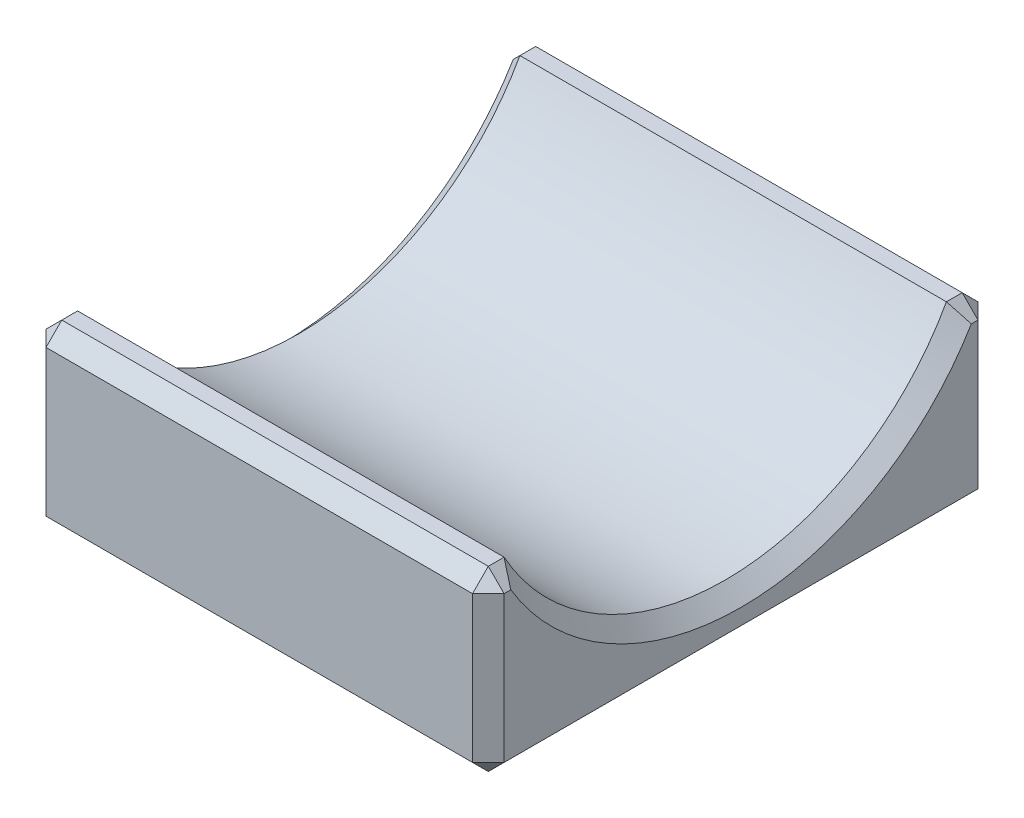
ISO-10303-21;
HEADER;
FILE_DESCRIPTION(('STEP AP214'),'2;1');
FILE_NAME('part.step','',(''),(''),'','','');
FILE_SCHEMA(('AUTOMOTIVE_DESIGN { 1 0 10303 214 1 1 1 1 }'));
ENDSEC;
DATA;
#1=APPLICATION_CONTEXT('core data for automotive mechanical design processes');
#2=APPLICATION_PROTOCOL_DEFINITION('international standard','automotive_design',2000,#1);
#3=PRODUCT_CONTEXT('',#1,'mechanical');
#4=PRODUCT('Part','Part','',(#3));
#5=PRODUCT_RELATED_PRODUCT_CATEGORY('part','',(#4));
#6=PRODUCT_DEFINITION_FORMATION('','',#4);
#7=PRODUCT_DEFINITION_CONTEXT('part definition',#1,'design');
#8=PRODUCT_DEFINITION('design','',#6,#7);
#9=PRODUCT_DEFINITION_SHAPE('','',#8);
#10=(LENGTH_UNIT() NAMED_UNIT(*) SI_UNIT(.MILLI.,.METRE.));
#11=(NAMED_UNIT(*) PLANE_ANGLE_UNIT() SI_UNIT($,.RADIAN.));
#12=(NAMED_UNIT(*) SI_UNIT($,.STERADIAN.) SOLID_ANGLE_UNIT());
#13=UNCERTAINTY_MEASURE_WITH_UNIT(LENGTH_MEASURE(1.E-05),#10,'distance_accuracy_value','');
#14=(GEOMETRIC_REPRESENTATION_CONTEXT(3) GLOBAL_UNCERTAINTY_ASSIGNED_CONTEXT((#13)) GLOBAL_UNIT_ASSIGNED_CONTEXT((#10,
#11,#12)) REPRESENTATION_CONTEXT('',''));
#15=CARTESIAN_POINT('',(0.,0.,0.));
#16=DIRECTION('',(0.,0.,1.));
#17=DIRECTION('',(1.,0.,0.));
#18=AXIS2_PLACEMENT_3D('',#15,#16,#17);
#19=CARTESIAN_POINT('',(-42.,17.5,83.6290559242941));
#20=DIRECTION('',(-1.,0.,0.));
#21=DIRECTION('',(0.,0.,1.));
#22=AXIS2_PLACEMENT_3D('',#19,#20,#21);
#23=PLANE('',#22);
#24=DIRECTION('',(0.,1.,0.));
#25=VECTOR('',#24,1.);
#26=CARTESIAN_POINT('',(-42.,13.6270166537926,91.1290559242941));
#27=LINE('',#26,#25);
#28=CARTESIAN_POINT('',(-42.,8.5,91.1290559242941));
#29=VERTEX_POINT('',#28);
#30=CARTESIAN_POINT('',(-42.,13.1270166537926,91.1290559242941));
#31=VERTEX_POINT('',#30);
#32=EDGE_CURVE('E250',#29,#31,#27,.T.);
#33=ORIENTED_EDGE('',*,*,#32,.T.);
#34=DIRECTION('',(0.,0.,-1.));
#35=VECTOR('',#34,1.);
#36=CARTESIAN_POINT('',(-42.,13.1270166537926,90.6290559242941));
#37=LINE('',#36,#35);
#38=CARTESIAN_POINT('',(-42.,13.1270166537926,90.9178841328467));
#39=VERTEX_POINT('',#38);
#40=EDGE_CURVE('E11',#31,#39,#37,.T.);
#41=ORIENTED_EDGE('',*,*,#40,.T.);
#42=CARTESIAN_POINT('',(-42.,17.5,83.6290559242941));
#43=DIRECTION('',(-1.,0.,0.));
#44=DIRECTION('',(0.,0.,1.));
#45=AXIS2_PLACEMENT_3D('',#42,#43,#44);
#46=CIRCLE('',#45,8.5);
#47=CARTESIAN_POINT('',(-42.,13.1270166537926,76.3402277157414));
#48=VERTEX_POINT('',#47);
#49=EDGE_CURVE('E58',#39,#48,#46,.F.);
#50=ORIENTED_EDGE('',*,*,#49,.T.);
#51=DIRECTION('',(0.,0.,-1.));
#52=VECTOR('',#51,1.);
#53=CARTESIAN_POINT('',(-42.,13.1270166537926,75.6290559242941));
#54=LINE('',#53,#52);
#55=CARTESIAN_POINT('',(-42.,13.1270166537926,76.1290559242941));
#56=VERTEX_POINT('',#55);
#57=EDGE_CURVE('E256',#48,#56,#54,.T.);
#58=ORIENTED_EDGE('',*,*,#57,.T.);
#59=DIRECTION('',(0.,-1.,0.));
#60=VECTOR('',#59,1.);
#61=CARTESIAN_POINT('',(-42.,8.,76.1290559242941));
#62=LINE('',#61,#60);
#63=CARTESIAN_POINT('',(-42.,8.5,76.1290559242941));
#64=VERTEX_POINT('',#63);
#65=EDGE_CURVE('E254',#56,#64,#62,.T.);
#66=ORIENTED_EDGE('',*,*,#65,.T.);
#67=DIRECTION('',(0.,0.,1.));
#68=VECTOR('',#67,1.);
#69=CARTESIAN_POINT('',(-42.,8.5,91.6290559242941));
#70=LINE('',#69,#68);
#71=EDGE_CURVE('E252',#64,#29,#70,.T.);
#72=ORIENTED_EDGE('',*,*,#71,.T.);
#73=EDGE_LOOP('',(#33,#41,#50,#58,#66,#72));
#74=FACE_BOUND('',#73,.T.);
#75=ADVANCED_FACE('F43',(#74),#23,.T.);
#76=CARTESIAN_POINT('',(-10.5393597873766,13.6270166537926,76.6290559242941));
#77=DIRECTION('',(0.,-1.,0.));
#78=DIRECTION('',(0.,0.,-1.));
#79=AXIS2_PLACEMENT_3D('',#76,#77,#78);
#80=PLANE('',#79);
#81=DIRECTION('',(-1.,0.,0.));
#82=VECTOR('',#81,1.);
#83=CARTESIAN_POINT('',(-10.5393597873766,13.6270166537926,76.6290559242941));
#84=LINE('',#83,#82);
#85=CARTESIAN_POINT('',(-28.,13.6270166537926,76.6290559242941));
#86=VERTEX_POINT('',#85);
#87=CARTESIAN_POINT('',(-41.5,13.6270166537926,76.6290559242941));
#88=VERTEX_POINT('',#87);
#89=EDGE_CURVE('E530',#86,#88,#84,.T.);
#90=ORIENTED_EDGE('',*,*,#89,.F.);
#91=DIRECTION('',(0.,0.,-1.));
#92=VECTOR('',#91,1.);
#93=CARTESIAN_POINT('',(-28.,13.6270166537926,76.6290559242941));
#94=LINE('',#93,#92);
#95=CARTESIAN_POINT('',(-28.,13.6270166537926,76.1290559242941));
#96=VERTEX_POINT('',#95);
#97=EDGE_CURVE('E225',#86,#96,#94,.T.);
#98=ORIENTED_EDGE('',*,*,#97,.T.);
#99=DIRECTION('',(-1.,0.,0.));
#100=VECTOR('',#99,1.);
#101=CARTESIAN_POINT('',(-10.5393597873766,13.6270166537926,76.1290559242941));
#102=LINE('',#101,#100);
#103=CARTESIAN_POINT('',(-41.5,13.6270166537926,76.1290559242941));
#104=VERTEX_POINT('',#103);
#105=EDGE_CURVE('E222',#96,#104,#102,.T.);
#106=ORIENTED_EDGE('',*,*,#105,.T.);
#107=DIRECTION('',(0.,0.,1.));
#108=VECTOR('',#107,1.);
#109=CARTESIAN_POINT('',(-41.5,13.6270166537926,76.6290559242941));
#110=LINE('',#109,#108);
#111=EDGE_CURVE('E220',#104,#88,#110,.T.);
#112=ORIENTED_EDGE('',*,*,#111,.T.);
#113=EDGE_LOOP('',(#90,#98,#106,#112));
#114=FACE_BOUND('',#113,.T.);
#115=ADVANCED_FACE('F410',(#114),#80,.F.);
#116=CARTESIAN_POINT('',(-10.5393597873766,13.6270166537926,75.6290559242941));
#117=DIRECTION('',(0.,0.,1.));
#118=DIRECTION('',(1.,0.,0.));
#119=AXIS2_PLACEMENT_3D('',#116,#117,#118);
#120=PLANE('',#119);
#121=DIRECTION('',(1.,0.,0.));
#122=VECTOR('',#121,1.);
#123=CARTESIAN_POINT('',(-10.5393597873766,13.1270166537926,75.6290559242941));
#124=LINE('',#123,#122);
#125=CARTESIAN_POINT('',(-41.5,13.1270166537926,75.6290559242941));
#126=VERTEX_POINT('',#125);
#127=CARTESIAN_POINT('',(-28.,13.1270166537926,75.6290559242941));
#128=VERTEX_POINT('',#127);
#129=EDGE_CURVE('E213',#126,#128,#124,.T.);
#130=ORIENTED_EDGE('',*,*,#129,.T.);
#131=DIRECTION('',(0.,-1.,0.));
#132=VECTOR('',#131,1.);
#133=CARTESIAN_POINT('',(-28.,13.6270166537926,75.6290559242941));
#134=LINE('',#133,#132);
#135=CARTESIAN_POINT('',(-28.,8.49999999999999,75.6290559242941));
#136=VERTEX_POINT('',#135);
#137=EDGE_CURVE('E218',#128,#136,#134,.T.);
#138=ORIENTED_EDGE('',*,*,#137,.T.);
#139=DIRECTION('',(-1.,0.,0.));
#140=VECTOR('',#139,1.);
#141=CARTESIAN_POINT('',(-10.5393597873766,8.49999999999999,75.6290559242941));
#142=LINE('',#141,#140);
#143=CARTESIAN_POINT('',(-41.5,8.49999999999999,75.6290559242941));
#144=VERTEX_POINT('',#143);
#145=EDGE_CURVE('E215',#136,#144,#142,.T.);
#146=ORIENTED_EDGE('',*,*,#145,.T.);
#147=DIRECTION('',(0.,1.,0.));
#148=VECTOR('',#147,1.);
#149=CARTESIAN_POINT('',(-41.5,13.6270166537926,75.6290559242941));
#150=LINE('',#149,#148);
#151=EDGE_CURVE('E211',#144,#126,#150,.T.);
#152=ORIENTED_EDGE('',*,*,#151,.T.);
#153=EDGE_LOOP('',(#130,#138,#146,#152));
#154=FACE_BOUND('',#153,.T.);
#155=ADVANCED_FACE('F416',(#154),#120,.F.);
#156=CARTESIAN_POINT('',(-10.5393597873766,8.,75.6290559242941));
#157=DIRECTION('',(0.,1.,0.));
#158=DIRECTION('',(0.,0.,1.));
#159=AXIS2_PLACEMENT_3D('',#156,#157,#158);
#160=PLANE('',#159);
#161=DIRECTION('',(1.,0.,0.));
#162=VECTOR('',#161,1.);
#163=CARTESIAN_POINT('',(-10.5393597873766,8.,76.1290559242941));
#164=LINE('',#163,#162);
#165=CARTESIAN_POINT('',(-41.5,8.,76.1290559242941));
#166=VERTEX_POINT('',#165);
#167=CARTESIAN_POINT('',(-28.,8.,76.1290559242941));
#168=VERTEX_POINT('',#167);
#169=EDGE_CURVE('E193',#166,#168,#164,.T.);
#170=ORIENTED_EDGE('',*,*,#169,.T.);
#171=DIRECTION('',(0.,0.,1.));
#172=VECTOR('',#171,1.);
#173=CARTESIAN_POINT('',(-28.,8.,75.6290559242941));
#174=LINE('',#173,#172);
#175=CARTESIAN_POINT('',(-28.,8.,91.1290559242941));
#176=VERTEX_POINT('',#175);
#177=EDGE_CURVE('E198',#168,#176,#174,.T.);
#178=ORIENTED_EDGE('',*,*,#177,.T.);
#179=DIRECTION('',(-1.,0.,0.));
#180=VECTOR('',#179,1.);
#181=CARTESIAN_POINT('',(-10.5393597873766,8.,91.1290559242941));
#182=LINE('',#181,#180);
#183=CARTESIAN_POINT('',(-41.5,8.,91.1290559242941));
#184=VERTEX_POINT('',#183);
#185=EDGE_CURVE('E169',#176,#184,#182,.T.);
#186=ORIENTED_EDGE('',*,*,#185,.T.);
#187=DIRECTION('',(0.,0.,-1.));
#188=VECTOR('',#187,1.);
#189=CARTESIAN_POINT('',(-41.5,8.,75.6290559242941));
#190=LINE('',#189,#188);
#191=EDGE_CURVE('E187',#184,#166,#190,.T.);
#192=ORIENTED_EDGE('',*,*,#191,.T.);
#193=EDGE_LOOP('',(#170,#178,#186,#192));
#194=FACE_BOUND('',#193,.T.);
#195=ADVANCED_FACE('F196',(#194),#160,.F.);
#196=CARTESIAN_POINT('',(-10.5393597873766,8.,91.6290559242941));
#197=DIRECTION('',(0.,0.,-1.));
#198=DIRECTION('',(-1.,0.,0.));
#199=AXIS2_PLACEMENT_3D('',#196,#197,#198);
#200=PLANE('',#199);
#201=DIRECTION('',(0.,-1.,0.));
#202=VECTOR('',#201,1.);
#203=CARTESIAN_POINT('',(-41.5,8.,91.6290559242941));
#204=LINE('',#203,#202);
#205=CARTESIAN_POINT('',(-41.5,13.1270166537926,91.6290559242941));
#206=VERTEX_POINT('',#205);
#207=CARTESIAN_POINT('',(-41.5,8.49999999999999,91.6290559242941));
#208=VERTEX_POINT('',#207);
#209=EDGE_CURVE('E206',#206,#208,#204,.T.);
#210=ORIENTED_EDGE('',*,*,#209,.T.);
#211=DIRECTION('',(1.,0.,0.));
#212=VECTOR('',#211,1.);
#213=CARTESIAN_POINT('',(-10.5393597873766,8.49999999999999,91.6290559242941));
#214=LINE('',#213,#212);
#215=CARTESIAN_POINT('',(-28.,8.49999999999999,91.6290559242941));
#216=VERTEX_POINT('',#215);
#217=EDGE_CURVE('E171',#208,#216,#214,.T.);
#218=ORIENTED_EDGE('',*,*,#217,.T.);
#219=DIRECTION('',(0.,1.,0.));
#220=VECTOR('',#219,1.);
#221=CARTESIAN_POINT('',(-28.,8.,91.6290559242941));
#222=LINE('',#221,#220);
#223=CARTESIAN_POINT('',(-28.,13.1270166537926,91.6290559242941));
#224=VERTEX_POINT('',#223);
#225=EDGE_CURVE('E208',#216,#224,#222,.T.);
#226=ORIENTED_EDGE('',*,*,#225,.T.);
#227=DIRECTION('',(-1.,0.,0.));
#228=VECTOR('',#227,1.);
#229=CARTESIAN_POINT('',(-10.5393597873766,13.1270166537926,91.6290559242941));
#230=LINE('',#229,#228);
#231=EDGE_CURVE('E201',#224,#206,#230,.T.);
#232=ORIENTED_EDGE('',*,*,#231,.T.);
#233=EDGE_LOOP('',(#210,#218,#226,#232));
#234=FACE_BOUND('',#233,.T.);
#235=ADVANCED_FACE('F425',(#234),#200,.F.);
#236=CARTESIAN_POINT('',(-10.5393597873766,13.6270166537926,91.6290559242941));
#237=DIRECTION('',(0.,-1.,0.));
#238=DIRECTION('',(0.,0.,-1.));
#239=AXIS2_PLACEMENT_3D('',#236,#237,#238);
#240=PLANE('',#239);
#241=DIRECTION('',(1.,0.,0.));
#242=VECTOR('',#241,1.);
#243=CARTESIAN_POINT('',(-10.5393597873766,13.6270166537926,91.1290559242941));
#244=LINE('',#243,#242);
#245=CARTESIAN_POINT('',(-41.5,13.6270166537926,91.1290559242941));
#246=VERTEX_POINT('',#245);
#247=CARTESIAN_POINT('',(-28.,13.6270166537926,91.1290559242941));
#248=VERTEX_POINT('',#247);
#249=EDGE_CURVE('E244',#246,#248,#244,.T.);
#250=ORIENTED_EDGE('',*,*,#249,.T.);
#251=DIRECTION('',(0.,0.,-1.));
#252=VECTOR('',#251,1.);
#253=CARTESIAN_POINT('',(-28.,13.6270166537926,91.6290559242941));
#254=LINE('',#253,#252);
#255=CARTESIAN_POINT('',(-28.,13.6270166537926,90.6290559242941));
#256=VERTEX_POINT('',#255);
#257=EDGE_CURVE('E248',#248,#256,#254,.T.);
#258=ORIENTED_EDGE('',*,*,#257,.T.);
#259=DIRECTION('',(-1.,0.,0.));
#260=VECTOR('',#259,1.);
#261=CARTESIAN_POINT('',(-10.5393597873766,13.6270166537926,90.6290559242941));
#262=LINE('',#261,#260);
#263=CARTESIAN_POINT('',(-41.5,13.6270166537926,90.6290559242941));
#264=VERTEX_POINT('',#263);
#265=EDGE_CURVE('E194',#256,#264,#262,.T.);
#266=ORIENTED_EDGE('',*,*,#265,.T.);
#267=DIRECTION('',(0.,0.,1.));
#268=VECTOR('',#267,1.);
#269=CARTESIAN_POINT('',(-41.5,13.6270166537926,91.6290559242941));
#270=LINE('',#269,#268);
#271=EDGE_CURVE('E246',#264,#246,#270,.T.);
#272=ORIENTED_EDGE('',*,*,#271,.T.);
#273=EDGE_LOOP('',(#250,#258,#266,#272));
#274=FACE_BOUND('',#273,.T.);
#275=ADVANCED_FACE('F428',(#274),#240,.F.);
#276=CARTESIAN_POINT('',(-10.5393597873766,17.5,83.6290559242941));
#277=DIRECTION('',(-1.,0.,0.));
#278=DIRECTION('',(0.,0.,1.));
#279=AXIS2_PLACEMENT_3D('',#276,#277,#278);
#280=CYLINDRICAL_SURFACE('',#279,7.99999999999999);
#281=ORIENTED_EDGE('',*,*,#265,.F.);
#282=CARTESIAN_POINT('',(-28.,17.5,83.6290559242941));
#283=DIRECTION('',(-1.,0.,0.));
#284=DIRECTION('',(0.,0.,1.));
#285=AXIS2_PLACEMENT_3D('',#282,#283,#284);
#286=CIRCLE('',#285,7.99999999999999);
#287=EDGE_CURVE('E229',#256,#86,#286,.F.);
#288=ORIENTED_EDGE('',*,*,#287,.T.);
#289=ORIENTED_EDGE('',*,*,#89,.T.);
#290=CARTESIAN_POINT('',(-41.5,17.5,83.6290559242941));
#291=DIRECTION('',(-1.,0.,0.));
#292=DIRECTION('',(0.,0.,1.));
#293=AXIS2_PLACEMENT_3D('',#290,#291,#292);
#294=CIRCLE('',#293,7.99999999999999);
#295=EDGE_CURVE('E227',#88,#264,#294,.T.);
#296=ORIENTED_EDGE('',*,*,#295,.T.);
#297=EDGE_LOOP('',(#281,#288,#289,#296));
#298=FACE_BOUND('',#297,.T.);
#299=ADVANCED_FACE('F405',(#298),#280,.F.);
#300=CARTESIAN_POINT('',(-27.5,25.5,83.6290559242941));
#301=DIRECTION('',(-1.,0.,0.));
#302=DIRECTION('',(0.,0.,1.));
#303=AXIS2_PLACEMENT_3D('',#300,#301,#302);
#304=PLANE('',#303);
#305=DIRECTION('',(0.,0.,1.));
#306=VECTOR('',#305,1.);
#307=CARTESIAN_POINT('',(-27.5,13.1270166537926,83.6290559242941));
#308=LINE('',#307,#306);
#309=CARTESIAN_POINT('',(-27.5,13.1270166537926,76.1290559242941));
#310=VERTEX_POINT('',#309);
#311=CARTESIAN_POINT('',(-27.5,13.1270166537926,76.3402277157414));
#312=VERTEX_POINT('',#311);
#313=EDGE_CURVE('E239',#310,#312,#308,.T.);
#314=ORIENTED_EDGE('',*,*,#313,.T.);
#315=CARTESIAN_POINT('',(-27.5,17.5,83.6290559242941));
#316=DIRECTION('',(-1.,0.,0.));
#317=DIRECTION('',(0.,0.,1.));
#318=AXIS2_PLACEMENT_3D('',#315,#316,#317);
#319=CIRCLE('',#318,8.5);
#320=CARTESIAN_POINT('',(-27.5,13.1270166537926,90.9178841328467));
#321=VERTEX_POINT('',#320);
#322=EDGE_CURVE('E241',#312,#321,#319,.T.);
#323=ORIENTED_EDGE('',*,*,#322,.T.);
#324=DIRECTION('',(0.,0.,1.));
#325=VECTOR('',#324,1.);
#326=CARTESIAN_POINT('',(-27.5,13.1270166537926,83.6290559242941));
#327=LINE('',#326,#325);
#328=CARTESIAN_POINT('',(-27.5,13.1270166537926,91.1290559242941));
#329=VERTEX_POINT('',#328);
#330=EDGE_CURVE('E231',#321,#329,#327,.T.);
#331=ORIENTED_EDGE('',*,*,#330,.T.);
#332=DIRECTION('',(0.,-1.,0.));
#333=VECTOR('',#332,1.);
#334=CARTESIAN_POINT('',(-27.5,25.5,91.1290559242941));
#335=LINE('',#334,#333);
#336=CARTESIAN_POINT('',(-27.5,8.5,91.1290559242941));
#337=VERTEX_POINT('',#336);
#338=EDGE_CURVE('E233',#329,#337,#335,.T.);
#339=ORIENTED_EDGE('',*,*,#338,.T.);
#340=DIRECTION('',(0.,0.,-1.));
#341=VECTOR('',#340,1.);
#342=CARTESIAN_POINT('',(-27.5,8.5,83.6290559242941));
#343=LINE('',#342,#341);
#344=CARTESIAN_POINT('',(-27.5,8.5,76.1290559242941));
#345=VERTEX_POINT('',#344);
#346=EDGE_CURVE('E235',#337,#345,#343,.T.);
#347=ORIENTED_EDGE('',*,*,#346,.T.);
#348=DIRECTION('',(0.,1.,0.));
#349=VECTOR('',#348,1.);
#350=CARTESIAN_POINT('',(-27.5,25.5,76.1290559242941));
#351=LINE('',#350,#349);
#352=EDGE_CURVE('E237',#345,#310,#351,.T.);
#353=ORIENTED_EDGE('',*,*,#352,.T.);
#354=EDGE_LOOP('',(#314,#323,#331,#339,#347,#353));
#355=FACE_BOUND('',#354,.T.);
#356=ADVANCED_FACE('F397',(#355),#304,.F.);
#357=CARTESIAN_POINT('',(-28.,13.6270166537926,76.6290559242941));
#358=DIRECTION('',(-0.707106781186554,-0.707106781186542,0.));
#359=DIRECTION('',(0.,0.,-1.));
#360=AXIS2_PLACEMENT_3D('',#357,#358,#359);
#361=PLANE('',#360);
#362=DIRECTION('',(-0.707106781186541,0.707106781186554,0.));
#363=VECTOR('',#362,1.);
#364=CARTESIAN_POINT('',(-27.75,13.3770166537926,76.1290559242941));
#365=LINE('',#364,#363);
#366=EDGE_CURVE('E538',#96,#310,#365,.F.);
#367=ORIENTED_EDGE('',*,*,#366,.F.);
#368=ORIENTED_EDGE('',*,*,#97,.F.);
#369=CARTESIAN_POINT('',(-28.,13.6270166537926,76.6290559242941));
#370=CARTESIAN_POINT('',(-27.9169074735685,13.5439241273611,76.5800840243497));
#371=CARTESIAN_POINT('',(-27.8336945278349,13.4607111816275,76.5315290480262));
#372=CARTESIAN_POINT('',(-27.6670278609856,13.2940445147782,76.4352529791412));
#373=CARTESIAN_POINT('',(-27.5835741400524,13.210590793845,76.3875318859472));
#374=CARTESIAN_POINT('',(-27.5,13.1270166537926,76.3402277157414));
#375=B_SPLINE_CURVE_WITH_KNOTS('',3,(#369,#370,#371,#372,#373,#374),.UNSPECIFIED.,.F.,.F.,(4,2,
4),(0.,0.38191277748957,0.763825265236644),.UNSPECIFIED.);
#376=EDGE_CURVE('E48',#312,#86,#375,.F.);
#377=ORIENTED_EDGE('',*,*,#376,.F.);
#378=ORIENTED_EDGE('',*,*,#313,.F.);
#379=EDGE_LOOP('',(#367,#368,#377,#378));
#380=FACE_BOUND('',#379,.T.);
#381=ADVANCED_FACE('F392',(#380),#361,.F.);
#382=CARTESIAN_POINT('',(-10.5393597873766,13.6270166537926,76.1290559242941));
#383=DIRECTION('',(0.,-0.707106781186538,0.707106781186557));
#384=DIRECTION('',(-1.,0.,0.));
#385=AXIS2_PLACEMENT_3D('',#382,#383,#384);
#386=PLANE('',#385);
#387=DIRECTION('',(0.,0.707106781186557,0.707106781186538));
#388=VECTOR('',#387,1.);
#389=CARTESIAN_POINT('',(-41.5,13.6270166537926,76.1290559242941));
#390=LINE('',#389,#388);
#391=EDGE_CURVE('E545',#104,#126,#390,.F.);
#392=ORIENTED_EDGE('',*,*,#391,.F.);
#393=ORIENTED_EDGE('',*,*,#105,.F.);
#394=DIRECTION('',(0.,-0.707106781186557,-0.707106781186538));
#395=VECTOR('',#394,1.);
#396=CARTESIAN_POINT('',(-28.,13.1270166537926,75.6290559242941));
#397=LINE('',#396,#395);
#398=EDGE_CURVE('E541',#128,#96,#397,.F.);
#399=ORIENTED_EDGE('',*,*,#398,.F.);
#400=ORIENTED_EDGE('',*,*,#129,.F.);
#401=EDGE_LOOP('',(#392,#393,#399,#400));
#402=FACE_BOUND('',#401,.T.);
#403=ADVANCED_FACE('F46',(#402),#386,.F.);
#404=CARTESIAN_POINT('',(-41.5,13.6270166537926,76.6290559242941));
#405=DIRECTION('',(-0.707106781186552,0.707106781186543,0.));
#406=DIRECTION('',(0.,0.,-1.));
#407=AXIS2_PLACEMENT_3D('',#404,#405,#406);
#408=PLANE('',#407);
#409=CARTESIAN_POINT('',(-42.,13.1270166537926,76.3402277157414));
#410=CARTESIAN_POINT('',(-41.9164258599476,13.210590793845,76.3875318859472));
#411=CARTESIAN_POINT('',(-41.8329721390145,13.2940445147781,76.4352529791412));
#412=CARTESIAN_POINT('',(-41.6663054721651,13.4607111816275,76.5315290480262));
#413=CARTESIAN_POINT('',(-41.5830925264316,13.5439241273611,76.5800840243497));
#414=CARTESIAN_POINT('',(-41.5,13.6270166537926,76.6290559242941));
#415=B_SPLINE_CURVE_WITH_KNOTS('',3,(#409,#410,#411,#412,#413,#414),.UNSPECIFIED.,.F.,.F.,(4,2,
4),(0.,0.381912487747064,0.763825265236641),.UNSPECIFIED.);
#416=EDGE_CURVE('E360',#88,#48,#415,.F.);
#417=ORIENTED_EDGE('',*,*,#416,.F.);
#418=ORIENTED_EDGE('',*,*,#111,.F.);
#419=DIRECTION('',(0.707106781186543,0.707106781186552,0.));
#420=VECTOR('',#419,1.);
#421=CARTESIAN_POINT('',(-41.5,13.6270166537926,76.1290559242941));
#422=LINE('',#421,#420);
#423=EDGE_CURVE('E368',#56,#104,#422,.T.);
#424=ORIENTED_EDGE('',*,*,#423,.F.);
#425=ORIENTED_EDGE('',*,*,#57,.F.);
#426=EDGE_LOOP('',(#417,#418,#424,#425));
#427=FACE_BOUND('',#426,.T.);
#428=ADVANCED_FACE('F371',(#427),#408,.T.);
#429=CARTESIAN_POINT('',(-28.,17.5,83.6290559242941));
#430=DIRECTION('',(1.,0.,0.));
#431=DIRECTION('',(0.,0.,-1.));
#432=AXIS2_PLACEMENT_3D('',#429,#430,#431);
#433=CONICAL_SURFACE('',#432,7.99999999999999,0.785398163397455);
#434=ORIENTED_EDGE('',*,*,#376,.T.);
#435=ORIENTED_EDGE('',*,*,#287,.F.);
#436=CARTESIAN_POINT('',(-27.5,13.1270166537926,90.9178841328467));
#437=CARTESIAN_POINT('',(-27.5835741400524,13.210590793845,90.8705799626409));
#438=CARTESIAN_POINT('',(-27.6670278609856,13.2940445147782,90.8228588694469));
#439=CARTESIAN_POINT('',(-27.8336945278349,13.4607111816275,90.726582800562));
#440=CARTESIAN_POINT('',(-27.9169074735685,13.5439241273611,90.6780278242385));
#441=CARTESIAN_POINT('',(-28.,13.6270166537926,90.6290559242941));
#442=B_SPLINE_CURVE_WITH_KNOTS('',3,(#436,#437,#438,#439,#440,#441),.UNSPECIFIED.,.F.,.F.,(4,2,
4),(0.,0.38191248774707,0.763825265236647),.UNSPECIFIED.);
#443=EDGE_CURVE('E353',#321,#256,#442,.T.);
#444=ORIENTED_EDGE('',*,*,#443,.F.);
#445=ORIENTED_EDGE('',*,*,#322,.F.);
#446=EDGE_LOOP('',(#434,#435,#444,#445));
#447=FACE_BOUND('',#446,.T.);
#448=ADVANCED_FACE('F349',(#447),#433,.F.);
#449=CARTESIAN_POINT('',(-28.,13.1270166537926,75.6290559242941));
#450=DIRECTION('',(0.577350269189638,0.57735026918961,-0.57735026918963));
#451=DIRECTION('',(-0.707106781186543,0.,-0.707106781186552));
#452=AXIS2_PLACEMENT_3D('',#449,#450,#451);
#453=PLANE('',#452);
#454=ORIENTED_EDGE('',*,*,#398,.T.);
#455=ORIENTED_EDGE('',*,*,#366,.T.);
#456=DIRECTION('',(0.707106781186543,0.,0.707106781186552));
#457=VECTOR('',#456,1.);
#458=CARTESIAN_POINT('',(-28.,13.1270166537926,75.6290559242941));
#459=LINE('',#458,#457);
#460=EDGE_CURVE('E361',#128,#310,#459,.T.);
#461=ORIENTED_EDGE('',*,*,#460,.F.);
#462=EDGE_LOOP('',(#454,#455,#461));
#463=FACE_BOUND('',#462,.T.);
#464=ADVANCED_FACE('F385',(#463),#453,.T.);
#465=CARTESIAN_POINT('',(-41.5,13.6270166537926,76.1290559242941));
#466=DIRECTION('',(-0.577350269189637,0.577350269189612,-0.577350269189628));
#467=DIRECTION('',(-0.707106781186543,0.,0.707106781186553));
#468=AXIS2_PLACEMENT_3D('',#465,#466,#467);
#469=PLANE('',#468);
#470=ORIENTED_EDGE('',*,*,#423,.T.);
#471=ORIENTED_EDGE('',*,*,#391,.T.);
#472=DIRECTION('',(-0.707106781186543,0.,0.707106781186552));
#473=VECTOR('',#472,1.);
#474=CARTESIAN_POINT('',(-41.75,13.1270166537926,75.8790559242941));
#475=LINE('',#474,#473);
#476=EDGE_CURVE('E306',#56,#126,#475,.F.);
#477=ORIENTED_EDGE('',*,*,#476,.F.);
#478=EDGE_LOOP('',(#470,#471,#477));
#479=FACE_BOUND('',#478,.T.);
#480=ADVANCED_FACE('F379',(#479),#469,.T.);
#481=CARTESIAN_POINT('',(-41.5,17.5,83.6290559242941));
#482=DIRECTION('',(-1.,0.,0.));
#483=DIRECTION('',(0.,0.,1.));
#484=AXIS2_PLACEMENT_3D('',#481,#482,#483);
#485=CONICAL_SURFACE('',#484,7.99999999999999,0.785398163397455);
#486=ORIENTED_EDGE('',*,*,#416,.T.);
#487=ORIENTED_EDGE('',*,*,#49,.F.);
#488=CARTESIAN_POINT('',(-42.,13.1270166537926,90.9178841328467));
#489=CARTESIAN_POINT('',(-41.9164258599476,13.210590793845,90.8705799626409));
#490=CARTESIAN_POINT('',(-41.8329721390145,13.2940445147782,90.8228588694469));
#491=CARTESIAN_POINT('',(-41.6663054721651,13.4607111816275,90.726582800562));
#492=CARTESIAN_POINT('',(-41.5830925264315,13.5439241273611,90.6780278242385));
#493=CARTESIAN_POINT('',(-41.5,13.6270166537926,90.6290559242941));
#494=B_SPLINE_CURVE_WITH_KNOTS('',3,(#488,#489,#490,#491,#492,#493),.UNSPECIFIED.,.F.,.F.,(4,2,
4),(0.,0.381912487747074,0.763825265236653),.UNSPECIFIED.);
#495=EDGE_CURVE('E66',#264,#39,#494,.F.);
#496=ORIENTED_EDGE('',*,*,#495,.F.);
#497=ORIENTED_EDGE('',*,*,#295,.F.);
#498=EDGE_LOOP('',(#486,#487,#496,#497));
#499=FACE_BOUND('',#498,.T.);
#500=ADVANCED_FACE('F309',(#499),#485,.F.);
#501=CARTESIAN_POINT('',(-28.,13.6270166537926,91.6290559242941));
#502=DIRECTION('',(-0.707106781186544,-0.707106781186551,0.));
#503=DIRECTION('',(0.,0.,-1.));
#504=AXIS2_PLACEMENT_3D('',#501,#502,#503);
#505=PLANE('',#504);
#506=ORIENTED_EDGE('',*,*,#443,.T.);
#507=ORIENTED_EDGE('',*,*,#257,.F.);
#508=DIRECTION('',(0.707106781186551,-0.707106781186544,0.));
#509=VECTOR('',#508,1.);
#510=CARTESIAN_POINT('',(-27.75,13.3770166537926,91.1290559242941));
#511=LINE('',#510,#509);
#512=EDGE_CURVE('E293',#329,#248,#511,.F.);
#513=ORIENTED_EDGE('',*,*,#512,.F.);
#514=ORIENTED_EDGE('',*,*,#330,.F.);
#515=EDGE_LOOP('',(#506,#507,#513,#514));
#516=FACE_BOUND('',#515,.T.);
#517=ADVANCED_FACE('F341',(#516),#505,.F.);
#518=CARTESIAN_POINT('',(-28.,13.6270166537926,75.6290559242941));
#519=DIRECTION('',(-0.707106781186552,0.,0.707106781186543));
#520=DIRECTION('',(0.,-1.,0.));
#521=AXIS2_PLACEMENT_3D('',#518,#519,#520);
#522=PLANE('',#521);
#523=ORIENTED_EDGE('',*,*,#460,.T.);
#524=ORIENTED_EDGE('',*,*,#352,.F.);
#525=DIRECTION('',(-0.707106781186543,0.,-0.707106781186552));
#526=VECTOR('',#525,1.);
#527=CARTESIAN_POINT('',(-27.75,8.5,75.8790559242941));
#528=LINE('',#527,#526);
#529=EDGE_CURVE('E290',#136,#345,#528,.F.);
#530=ORIENTED_EDGE('',*,*,#529,.F.);
#531=ORIENTED_EDGE('',*,*,#137,.F.);
#532=EDGE_LOOP('',(#523,#524,#530,#531));
#533=FACE_BOUND('',#532,.T.);
#534=ADVANCED_FACE('F334',(#533),#522,.F.);
#535=CARTESIAN_POINT('',(-10.5393597873766,8.49999999999999,75.6290559242941));
#536=DIRECTION('',(0.,0.707106781186552,0.707106781186543));
#537=DIRECTION('',(-1.,0.,0.));
#538=AXIS2_PLACEMENT_3D('',#535,#536,#537);
#539=PLANE('',#538);
#540=DIRECTION('',(0.,0.707106781186543,-0.707106781186552));
#541=VECTOR('',#540,1.);
#542=CARTESIAN_POINT('',(-41.5,8.49999999999999,75.6290559242941));
#543=LINE('',#542,#541);
#544=EDGE_CURVE('E284',#144,#166,#543,.F.);
#545=ORIENTED_EDGE('',*,*,#544,.F.);
#546=ORIENTED_EDGE('',*,*,#145,.F.);
#547=DIRECTION('',(0.,-0.707106781186543,0.707106781186552));
#548=VECTOR('',#547,1.);
#549=CARTESIAN_POINT('',(-28.,8.,76.1290559242941));
#550=LINE('',#549,#548);
#551=EDGE_CURVE('E287',#168,#136,#550,.F.);
#552=ORIENTED_EDGE('',*,*,#551,.F.);
#553=ORIENTED_EDGE('',*,*,#169,.F.);
#554=EDGE_LOOP('',(#545,#546,#552,#553));
#555=FACE_BOUND('',#554,.T.);
#556=ADVANCED_FACE('F327',(#555),#539,.F.);
#557=CARTESIAN_POINT('',(-41.5,13.6270166537926,75.6290559242941));
#558=DIRECTION('',(-0.707106781186552,0.,-0.707106781186543));
#559=DIRECTION('',(0.,-1.,0.));
#560=AXIS2_PLACEMENT_3D('',#557,#558,#559);
#561=PLANE('',#560);
#562=ORIENTED_EDGE('',*,*,#476,.T.);
#563=ORIENTED_EDGE('',*,*,#151,.F.);
#564=DIRECTION('',(0.707106781186543,0.,-0.707106781186552));
#565=VECTOR('',#564,1.);
#566=CARTESIAN_POINT('',(-41.5,8.49999999999999,75.6290559242941));
#567=LINE('',#566,#565);
#568=EDGE_CURVE('E282',#64,#144,#567,.T.);
#569=ORIENTED_EDGE('',*,*,#568,.F.);
#570=ORIENTED_EDGE('',*,*,#65,.F.);
#571=EDGE_LOOP('',(#562,#563,#569,#570));
#572=FACE_BOUND('',#571,.T.);
#573=ADVANCED_FACE('F321',(#572),#561,.T.);
#574=CARTESIAN_POINT('',(-41.5,13.6270166537926,91.6290559242941));
#575=DIRECTION('',(-0.707106781186543,0.707106781186552,0.));
#576=DIRECTION('',(0.,0.,-1.));
#577=AXIS2_PLACEMENT_3D('',#574,#575,#576);
#578=PLANE('',#577);
#579=ORIENTED_EDGE('',*,*,#495,.T.);
#580=ORIENTED_EDGE('',*,*,#40,.F.);
#581=DIRECTION('',(-0.707106781186552,-0.707106781186543,0.));
#582=VECTOR('',#581,1.);
#583=CARTESIAN_POINT('',(-41.5,13.6270166537926,91.1290559242941));
#584=LINE('',#583,#582);
#585=EDGE_CURVE('E279',#246,#31,#584,.T.);
#586=ORIENTED_EDGE('',*,*,#585,.F.);
#587=ORIENTED_EDGE('',*,*,#271,.F.);
#588=EDGE_LOOP('',(#579,#580,#586,#587));
#589=FACE_BOUND('',#588,.T.);
#590=ADVANCED_FACE('F313',(#589),#578,.T.);
#591=CARTESIAN_POINT('',(-10.5393597873766,13.1270166537926,91.6290559242941));
#592=DIRECTION('',(0.,-0.707106781186552,-0.707106781186543));
#593=DIRECTION('',(-1.,0.,0.));
#594=AXIS2_PLACEMENT_3D('',#591,#592,#593);
#595=PLANE('',#594);
#596=DIRECTION('',(0.,0.707106781186543,-0.707106781186552));
#597=VECTOR('',#596,1.);
#598=CARTESIAN_POINT('',(-28.,13.1270166537926,91.6290559242941));
#599=LINE('',#598,#597);
#600=EDGE_CURVE('E296',#248,#224,#599,.F.);
#601=ORIENTED_EDGE('',*,*,#600,.F.);
#602=ORIENTED_EDGE('',*,*,#249,.F.);
#603=DIRECTION('',(0.,-0.707106781186543,0.707106781186552));
#604=VECTOR('',#603,1.);
#605=CARTESIAN_POINT('',(-41.5,13.6270166537926,91.1290559242941));
#606=LINE('',#605,#604);
#607=EDGE_CURVE('E276',#206,#246,#606,.F.);
#608=ORIENTED_EDGE('',*,*,#607,.F.);
#609=ORIENTED_EDGE('',*,*,#231,.F.);
#610=EDGE_LOOP('',(#601,#602,#608,#609));
#611=FACE_BOUND('',#610,.T.);
#612=ADVANCED_FACE('F320',(#611),#595,.F.);
#613=CARTESIAN_POINT('',(-28.,13.1270166537926,91.6290559242941));
#614=DIRECTION('',(0.577350269189626,0.577350269189634,0.577350269189618));
#615=DIRECTION('',(-0.707106781186552,0.707106781186543,0.));
#616=AXIS2_PLACEMENT_3D('',#613,#614,#615);
#617=PLANE('',#616);
#618=ORIENTED_EDGE('',*,*,#512,.T.);
#619=ORIENTED_EDGE('',*,*,#600,.T.);
#620=DIRECTION('',(-0.707106781186543,0.,0.707106781186552));
#621=VECTOR('',#620,1.);
#622=CARTESIAN_POINT('',(-28.,13.1270166537926,91.6290559242941));
#623=LINE('',#622,#621);
#624=EDGE_CURVE('E273',#329,#224,#623,.T.);
#625=ORIENTED_EDGE('',*,*,#624,.F.);
#626=EDGE_LOOP('',(#618,#619,#625));
#627=FACE_BOUND('',#626,.T.);
#628=ADVANCED_FACE('F500',(#627),#617,.T.);
#629=CARTESIAN_POINT('',(-28.,8.,76.1290559242941));
#630=DIRECTION('',(0.577350269189635,-0.577350269189625,-0.577350269189617));
#631=DIRECTION('',(0.707106781186541,0.707106781186554,0.));
#632=AXIS2_PLACEMENT_3D('',#629,#630,#631);
#633=PLANE('',#632);
#634=ORIENTED_EDGE('',*,*,#551,.T.);
#635=ORIENTED_EDGE('',*,*,#529,.T.);
#636=DIRECTION('',(0.707106781186543,0.707106781186552,0.));
#637=VECTOR('',#636,1.);
#638=CARTESIAN_POINT('',(-28.,8.,76.1290559242941));
#639=LINE('',#638,#637);
#640=EDGE_CURVE('E270',#168,#345,#639,.T.);
#641=ORIENTED_EDGE('',*,*,#640,.F.);
#642=EDGE_LOOP('',(#634,#635,#641));
#643=FACE_BOUND('',#642,.T.);
#644=ADVANCED_FACE('F493',(#643),#633,.T.);
#645=CARTESIAN_POINT('',(-41.5,8.49999999999999,75.6290559242941));
#646=DIRECTION('',(-0.577350269189634,-0.577350269189626,-0.577350269189618));
#647=DIRECTION('',(0.707106781186543,-0.707106781186552,0.));
#648=AXIS2_PLACEMENT_3D('',#645,#646,#647);
#649=PLANE('',#648);
#650=ORIENTED_EDGE('',*,*,#568,.T.);
#651=ORIENTED_EDGE('',*,*,#544,.T.);
#652=DIRECTION('',(-0.707106781186542,0.707106781186553,0.));
#653=VECTOR('',#652,1.);
#654=CARTESIAN_POINT('',(-41.75,8.25,76.1290559242941));
#655=LINE('',#654,#653);
#656=EDGE_CURVE('E190',#64,#166,#655,.F.);
#657=ORIENTED_EDGE('',*,*,#656,.F.);
#658=EDGE_LOOP('',(#650,#651,#657));
#659=FACE_BOUND('',#658,.T.);
#660=ADVANCED_FACE('F486',(#659),#649,.T.);
#661=CARTESIAN_POINT('',(-41.5,13.6270166537926,91.1290559242941));
#662=DIRECTION('',(-0.577350269189626,0.577350269189634,0.577350269189618));
#663=DIRECTION('',(-0.707106781186552,-0.707106781186543,0.));
#664=AXIS2_PLACEMENT_3D('',#661,#662,#663);
#665=PLANE('',#664);
#666=ORIENTED_EDGE('',*,*,#607,.T.);
#667=ORIENTED_EDGE('',*,*,#585,.T.);
#668=DIRECTION('',(0.707106781186543,0.,0.707106781186552));
#669=VECTOR('',#668,1.);
#670=CARTESIAN_POINT('',(-41.75,13.1270166537926,91.3790559242941));
#671=LINE('',#670,#669);
#672=EDGE_CURVE('E266',#206,#31,#671,.F.);
#673=ORIENTED_EDGE('',*,*,#672,.F.);
#674=EDGE_LOOP('',(#666,#667,#673));
#675=FACE_BOUND('',#674,.T.);
#676=ADVANCED_FACE('F479',(#675),#665,.T.);
#677=CARTESIAN_POINT('',(-28.,8.,91.6290559242941));
#678=DIRECTION('',(-0.707106781186552,0.,-0.707106781186543));
#679=DIRECTION('',(0.,1.,0.));
#680=AXIS2_PLACEMENT_3D('',#677,#678,#679);
#681=PLANE('',#680);
#682=ORIENTED_EDGE('',*,*,#624,.T.);
#683=ORIENTED_EDGE('',*,*,#225,.F.);
#684=DIRECTION('',(0.707106781186543,0.,-0.707106781186552));
#685=VECTOR('',#684,1.);
#686=CARTESIAN_POINT('',(-28.,8.49999999999999,91.6290559242941));
#687=LINE('',#686,#685);
#688=EDGE_CURVE('E263',#337,#216,#687,.F.);
#689=ORIENTED_EDGE('',*,*,#688,.F.);
#690=ORIENTED_EDGE('',*,*,#338,.F.);
#691=EDGE_LOOP('',(#682,#683,#689,#690));
#692=FACE_BOUND('',#691,.T.);
#693=ADVANCED_FACE('F472',(#692),#681,.F.);
#694=CARTESIAN_POINT('',(-28.,8.,75.6290559242941));
#695=DIRECTION('',(-0.707106781186552,0.707106781186543,0.));
#696=DIRECTION('',(0.,0.,1.));
#697=AXIS2_PLACEMENT_3D('',#694,#695,#696);
#698=PLANE('',#697);
#699=ORIENTED_EDGE('',*,*,#640,.T.);
#700=ORIENTED_EDGE('',*,*,#346,.F.);
#701=DIRECTION('',(-0.707106781186543,-0.707106781186552,0.));
#702=VECTOR('',#701,1.);
#703=CARTESIAN_POINT('',(-27.75,8.25,91.1290559242941));
#704=LINE('',#703,#702);
#705=EDGE_CURVE('E184',#176,#337,#704,.F.);
#706=ORIENTED_EDGE('',*,*,#705,.F.);
#707=ORIENTED_EDGE('',*,*,#177,.F.);
#708=EDGE_LOOP('',(#699,#700,#706,#707));
#709=FACE_BOUND('',#708,.T.);
#710=ADVANCED_FACE('F466',(#709),#698,.F.);
#711=CARTESIAN_POINT('',(-41.5,8.,75.6290559242941));
#712=DIRECTION('',(-0.707106781186553,-0.707106781186542,0.));
#713=DIRECTION('',(0.,0.,1.));
#714=AXIS2_PLACEMENT_3D('',#711,#712,#713);
#715=PLANE('',#714);
#716=ORIENTED_EDGE('',*,*,#656,.T.);
#717=ORIENTED_EDGE('',*,*,#191,.F.);
#718=DIRECTION('',(0.707106781186542,-0.707106781186553,0.));
#719=VECTOR('',#718,1.);
#720=CARTESIAN_POINT('',(-41.5,8.,91.1290559242941));
#721=LINE('',#720,#719);
#722=EDGE_CURVE('E177',#29,#184,#721,.T.);
#723=ORIENTED_EDGE('',*,*,#722,.F.);
#724=ORIENTED_EDGE('',*,*,#71,.F.);
#725=EDGE_LOOP('',(#716,#717,#723,#724));
#726=FACE_BOUND('',#725,.T.);
#727=ADVANCED_FACE('F188',(#726),#715,.T.);
#728=CARTESIAN_POINT('',(-41.5,8.,91.6290559242941));
#729=DIRECTION('',(-0.707106781186552,0.,0.707106781186543));
#730=DIRECTION('',(0.,1.,0.));
#731=AXIS2_PLACEMENT_3D('',#728,#729,#730);
#732=PLANE('',#731);
#733=ORIENTED_EDGE('',*,*,#672,.T.);
#734=ORIENTED_EDGE('',*,*,#32,.F.);
#735=DIRECTION('',(-0.707106781186543,0.,-0.707106781186552));
#736=VECTOR('',#735,1.);
#737=CARTESIAN_POINT('',(-41.75,8.49999999999999,91.3790559242941));
#738=LINE('',#737,#736);
#739=EDGE_CURVE('E181',#208,#29,#738,.T.);
#740=ORIENTED_EDGE('',*,*,#739,.F.);
#741=ORIENTED_EDGE('',*,*,#209,.F.);
#742=EDGE_LOOP('',(#733,#734,#740,#741));
#743=FACE_BOUND('',#742,.T.);
#744=ADVANCED_FACE('F453',(#743),#732,.T.);
#745=CARTESIAN_POINT('',(-28.,8.49999999999999,91.6290559242941));
#746=DIRECTION('',(0.577350269189634,-0.577350269189628,0.577350269189616));
#747=DIRECTION('',(0.707106781186544,0.707106781186551,0.));
#748=AXIS2_PLACEMENT_3D('',#745,#746,#747);
#749=PLANE('',#748);
#750=ORIENTED_EDGE('',*,*,#705,.T.);
#751=ORIENTED_EDGE('',*,*,#688,.T.);
#752=DIRECTION('',(0.,0.707106781186543,0.707106781186552));
#753=VECTOR('',#752,1.);
#754=CARTESIAN_POINT('',(-28.,8.49999999999999,91.6290559242941));
#755=LINE('',#754,#753);
#756=EDGE_CURVE('E174',#176,#216,#755,.T.);
#757=ORIENTED_EDGE('',*,*,#756,.F.);
#758=EDGE_LOOP('',(#750,#751,#757));
#759=FACE_BOUND('',#758,.T.);
#760=ADVANCED_FACE('F447',(#759),#749,.T.);
#761=CARTESIAN_POINT('',(-41.5,8.,91.1290559242941));
#762=DIRECTION('',(-0.577350269189634,-0.577350269189626,0.577350269189618));
#763=DIRECTION('',(0.707106781186543,-0.707106781186552,0.));
#764=AXIS2_PLACEMENT_3D('',#761,#762,#763);
#765=PLANE('',#764);
#766=ORIENTED_EDGE('',*,*,#739,.T.);
#767=ORIENTED_EDGE('',*,*,#722,.T.);
#768=DIRECTION('',(0.,-0.707106781186543,-0.707106781186552));
#769=VECTOR('',#768,1.);
#770=CARTESIAN_POINT('',(-41.5,8.,91.1290559242941));
#771=LINE('',#770,#769);
#772=EDGE_CURVE('E165',#208,#184,#771,.T.);
#773=ORIENTED_EDGE('',*,*,#772,.F.);
#774=EDGE_LOOP('',(#766,#767,#773));
#775=FACE_BOUND('',#774,.T.);
#776=ADVANCED_FACE('F179',(#775),#765,.T.);
#777=CARTESIAN_POINT('',(-10.5393597873766,8.,91.1290559242941));
#778=DIRECTION('',(0.,0.707106781186552,-0.707106781186543));
#779=DIRECTION('',(-1.,0.,0.));
#780=AXIS2_PLACEMENT_3D('',#777,#778,#779);
#781=PLANE('',#780);
#782=ORIENTED_EDGE('',*,*,#756,.T.);
#783=ORIENTED_EDGE('',*,*,#217,.F.);
#784=ORIENTED_EDGE('',*,*,#772,.T.);
#785=ORIENTED_EDGE('',*,*,#185,.F.);
#786=EDGE_LOOP('',(#782,#783,#784,#785));
#787=FACE_BOUND('',#786,.T.);
#788=ADVANCED_FACE('F167',(#787),#781,.F.);
#789=CLOSED_SHELL('',(#75,#115,#155,#195,#235,#275,#299,#356,#381,#403,#428,#448,#464,#480,#500,
#517,#534,#556,#573,#590,#612,#628,#644,#660,#676,#693,#710,#727,#744,#760,#776,#788));
#790=MANIFOLD_SOLID_BREP('B2',#789);
#791=ADVANCED_BREP_SHAPE_REPRESENTATION('',(#18,#790),#14);
#792=SHAPE_DEFINITION_REPRESENTATION(#9,#791);
ENDSEC;
END-ISO-10303-21;
